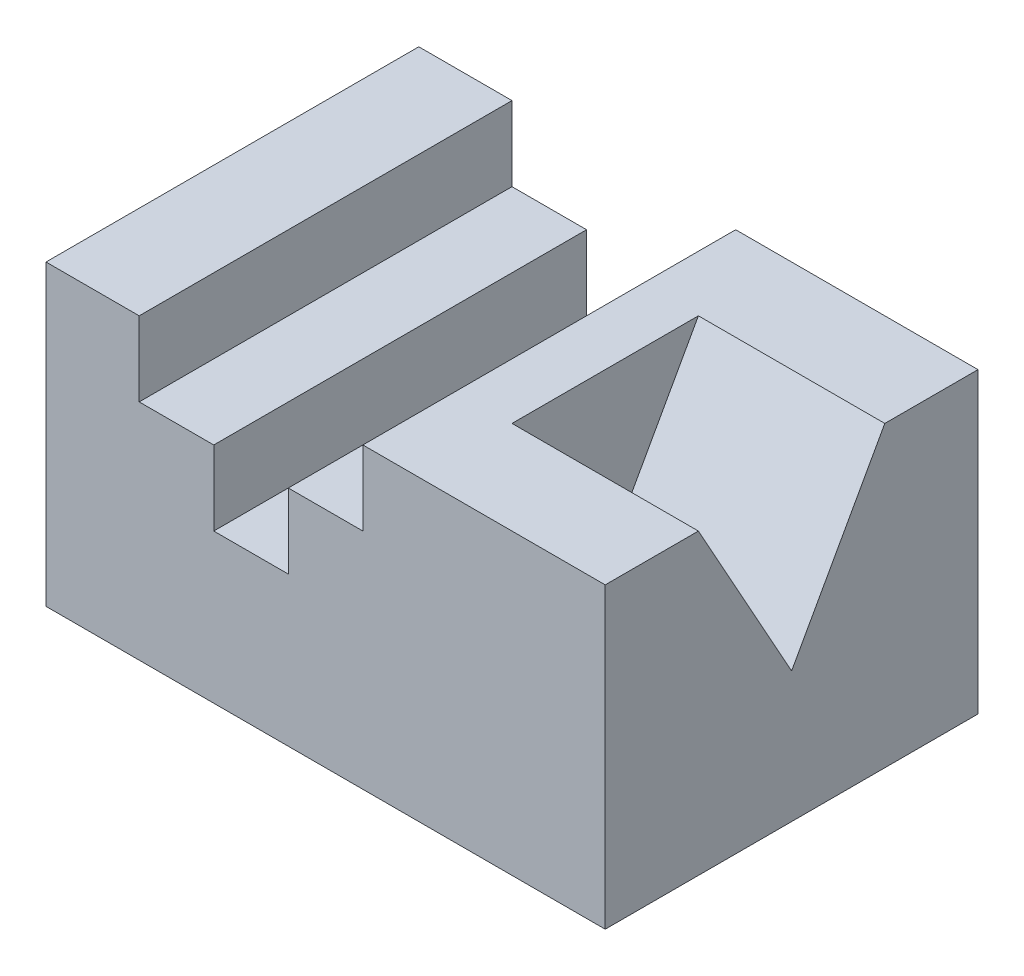
ISO-10303-21;
HEADER;
FILE_DESCRIPTION(('STEP AP214'),'2;1');
FILE_NAME('part.step','',(''),(''),'','','');
FILE_SCHEMA(('AUTOMOTIVE_DESIGN { 1 0 10303 214 1 1 1 1 }'));
ENDSEC;
DATA;
#1=APPLICATION_CONTEXT('core data for automotive mechanical design processes');
#2=APPLICATION_PROTOCOL_DEFINITION('international standard','automotive_design',2000,#1);
#3=PRODUCT_CONTEXT('',#1,'mechanical');
#4=PRODUCT('Part','Part','',(#3));
#5=PRODUCT_RELATED_PRODUCT_CATEGORY('part','',(#4));
#6=PRODUCT_DEFINITION_FORMATION('','',#4);
#7=PRODUCT_DEFINITION_CONTEXT('part definition',#1,'design');
#8=PRODUCT_DEFINITION('design','',#6,#7);
#9=PRODUCT_DEFINITION_SHAPE('','',#8);
#10=(LENGTH_UNIT() NAMED_UNIT(*) SI_UNIT(.MILLI.,.METRE.));
#11=(NAMED_UNIT(*) PLANE_ANGLE_UNIT() SI_UNIT($,.RADIAN.));
#12=(NAMED_UNIT(*) SI_UNIT($,.STERADIAN.) SOLID_ANGLE_UNIT());
#13=UNCERTAINTY_MEASURE_WITH_UNIT(LENGTH_MEASURE(1.E-05),#10,'distance_accuracy_value','');
#14=(GEOMETRIC_REPRESENTATION_CONTEXT(3) GLOBAL_UNCERTAINTY_ASSIGNED_CONTEXT((#13)) GLOBAL_UNIT_ASSIGNED_CONTEXT((#10,
#11,#12)) REPRESENTATION_CONTEXT('',''));
#15=CARTESIAN_POINT('',(0.,0.,0.));
#16=DIRECTION('',(0.,0.,1.));
#17=DIRECTION('',(1.,0.,0.));
#18=AXIS2_PLACEMENT_3D('',#15,#16,#17);
#19=CARTESIAN_POINT('',(150.,0.,-100.));
#20=DIRECTION('',(0.,-1.,0.));
#21=DIRECTION('',(1.,0.,0.));
#22=AXIS2_PLACEMENT_3D('',#19,#20,#21);
#23=PLANE('',#22);
#24=DIRECTION('',(1.,0.,0.));
#25=VECTOR('',#24,1.);
#26=CARTESIAN_POINT('',(150.,0.,0.));
#27=LINE('',#26,#25);
#28=CARTESIAN_POINT('',(0.,0.,0.));
#29=VERTEX_POINT('',#28);
#30=CARTESIAN_POINT('',(150.,0.,0.));
#31=VERTEX_POINT('',#30);
#32=EDGE_CURVE('E184',#29,#31,#27,.T.);
#33=ORIENTED_EDGE('',*,*,#32,.F.);
#34=DIRECTION('',(0.,0.,1.));
#35=VECTOR('',#34,1.);
#36=CARTESIAN_POINT('',(0.,0.,-100.));
#37=LINE('',#36,#35);
#38=CARTESIAN_POINT('',(0.,0.,-100.));
#39=VERTEX_POINT('',#38);
#40=EDGE_CURVE('E11',#39,#29,#37,.T.);
#41=ORIENTED_EDGE('',*,*,#40,.F.);
#42=DIRECTION('',(1.,0.,0.));
#43=VECTOR('',#42,1.);
#44=CARTESIAN_POINT('',(150.,0.,-100.));
#45=LINE('',#44,#43);
#46=CARTESIAN_POINT('',(150.,0.,-100.));
#47=VERTEX_POINT('',#46);
#48=EDGE_CURVE('E229',#39,#47,#45,.T.);
#49=ORIENTED_EDGE('',*,*,#48,.T.);
#50=DIRECTION('',(0.,0.,1.));
#51=VECTOR('',#50,1.);
#52=CARTESIAN_POINT('',(150.,0.,-100.));
#53=LINE('',#52,#51);
#54=EDGE_CURVE('E48',#47,#31,#53,.T.);
#55=ORIENTED_EDGE('',*,*,#54,.T.);
#56=EDGE_LOOP('',(#33,#41,#49,#55));
#57=FACE_BOUND('',#56,.T.);
#58=ADVANCED_FACE('F45',(#57),#23,.T.);
#59=CARTESIAN_POINT('',(0.,0.,-100.));
#60=DIRECTION('',(-1.,0.,0.));
#61=DIRECTION('',(0.,0.,1.));
#62=AXIS2_PLACEMENT_3D('',#59,#60,#61);
#63=PLANE('',#62);
#64=DIRECTION('',(0.,-1.,0.));
#65=VECTOR('',#64,1.);
#66=CARTESIAN_POINT('',(0.,0.,0.));
#67=LINE('',#66,#65);
#68=CARTESIAN_POINT('',(0.,80.,0.));
#69=VERTEX_POINT('',#68);
#70=EDGE_CURVE('E226',#69,#29,#67,.T.);
#71=ORIENTED_EDGE('',*,*,#70,.F.);
#72=DIRECTION('',(0.,0.,1.));
#73=VECTOR('',#72,1.);
#74=CARTESIAN_POINT('',(0.,80.,-100.));
#75=LINE('',#74,#73);
#76=CARTESIAN_POINT('',(0.,80.,-100.));
#77=VERTEX_POINT('',#76);
#78=EDGE_CURVE('E54',#77,#69,#75,.T.);
#79=ORIENTED_EDGE('',*,*,#78,.F.);
#80=DIRECTION('',(0.,-1.,0.));
#81=VECTOR('',#80,1.);
#82=CARTESIAN_POINT('',(0.,0.,-100.));
#83=LINE('',#82,#81);
#84=EDGE_CURVE('E170',#77,#39,#83,.T.);
#85=ORIENTED_EDGE('',*,*,#84,.T.);
#86=ORIENTED_EDGE('',*,*,#40,.T.);
#87=EDGE_LOOP('',(#71,#79,#85,#86));
#88=FACE_BOUND('',#87,.T.);
#89=ADVANCED_FACE('F267',(#88),#63,.T.);
#90=CARTESIAN_POINT('',(0.,80.,-100.));
#91=DIRECTION('',(0.,1.,0.));
#92=DIRECTION('',(0.,0.,1.));
#93=AXIS2_PLACEMENT_3D('',#90,#91,#92);
#94=PLANE('',#93);
#95=DIRECTION('',(-1.,0.,0.));
#96=VECTOR('',#95,1.);
#97=CARTESIAN_POINT('',(0.,80.,0.));
#98=LINE('',#97,#96);
#99=CARTESIAN_POINT('',(25.,80.,0.));
#100=VERTEX_POINT('',#99);
#101=EDGE_CURVE('E156',#100,#69,#98,.T.);
#102=ORIENTED_EDGE('',*,*,#101,.F.);
#103=DIRECTION('',(0.,0.,1.));
#104=VECTOR('',#103,1.);
#105=CARTESIAN_POINT('',(25.,80.,-100.));
#106=LINE('',#105,#104);
#107=CARTESIAN_POINT('',(25.,80.,-100.));
#108=VERTEX_POINT('',#107);
#109=EDGE_CURVE('E150',#108,#100,#106,.T.);
#110=ORIENTED_EDGE('',*,*,#109,.F.);
#111=DIRECTION('',(-1.,0.,0.));
#112=VECTOR('',#111,1.);
#113=CARTESIAN_POINT('',(0.,80.,-100.));
#114=LINE('',#113,#112);
#115=EDGE_CURVE('E153',#108,#77,#114,.T.);
#116=ORIENTED_EDGE('',*,*,#115,.T.);
#117=ORIENTED_EDGE('',*,*,#78,.T.);
#118=EDGE_LOOP('',(#102,#110,#116,#117));
#119=FACE_BOUND('',#118,.T.);
#120=ADVANCED_FACE('F152',(#119),#94,.T.);
#121=CARTESIAN_POINT('',(25.,80.,-100.));
#122=DIRECTION('',(1.,0.,0.));
#123=DIRECTION('',(0.,1.,0.));
#124=AXIS2_PLACEMENT_3D('',#121,#122,#123);
#125=PLANE('',#124);
#126=DIRECTION('',(0.,1.,0.));
#127=VECTOR('',#126,1.);
#128=CARTESIAN_POINT('',(25.,80.,0.));
#129=LINE('',#128,#127);
#130=CARTESIAN_POINT('',(25.,60.,0.));
#131=VERTEX_POINT('',#130);
#132=EDGE_CURVE('E221',#131,#100,#129,.T.);
#133=ORIENTED_EDGE('',*,*,#132,.F.);
#134=DIRECTION('',(0.,0.,1.));
#135=VECTOR('',#134,1.);
#136=CARTESIAN_POINT('',(25.,60.,-100.));
#137=LINE('',#136,#135);
#138=CARTESIAN_POINT('',(25.,60.,-100.));
#139=VERTEX_POINT('',#138);
#140=EDGE_CURVE('E162',#139,#131,#137,.T.);
#141=ORIENTED_EDGE('',*,*,#140,.F.);
#142=DIRECTION('',(0.,1.,0.));
#143=VECTOR('',#142,1.);
#144=CARTESIAN_POINT('',(25.,80.,-100.));
#145=LINE('',#144,#143);
#146=EDGE_CURVE('E168',#139,#108,#145,.T.);
#147=ORIENTED_EDGE('',*,*,#146,.T.);
#148=ORIENTED_EDGE('',*,*,#109,.T.);
#149=EDGE_LOOP('',(#133,#141,#147,#148));
#150=FACE_BOUND('',#149,.T.);
#151=ADVANCED_FACE('F173',(#150),#125,.T.);
#152=CARTESIAN_POINT('',(25.,60.,-100.));
#153=DIRECTION('',(0.,1.,0.));
#154=DIRECTION('',(0.,0.,1.));
#155=AXIS2_PLACEMENT_3D('',#152,#153,#154);
#156=PLANE('',#155);
#157=DIRECTION('',(-1.,0.,0.));
#158=VECTOR('',#157,1.);
#159=CARTESIAN_POINT('',(25.,60.,0.));
#160=LINE('',#159,#158);
#161=CARTESIAN_POINT('',(45.,60.,0.));
#162=VERTEX_POINT('',#161);
#163=EDGE_CURVE('E217',#162,#131,#160,.T.);
#164=ORIENTED_EDGE('',*,*,#163,.F.);
#165=DIRECTION('',(0.,0.,1.));
#166=VECTOR('',#165,1.);
#167=CARTESIAN_POINT('',(45.,60.,-100.));
#168=LINE('',#167,#166);
#169=CARTESIAN_POINT('',(45.,60.,-100.));
#170=VERTEX_POINT('',#169);
#171=EDGE_CURVE('E235',#170,#162,#168,.T.);
#172=ORIENTED_EDGE('',*,*,#171,.F.);
#173=DIRECTION('',(-1.,0.,0.));
#174=VECTOR('',#173,1.);
#175=CARTESIAN_POINT('',(25.,60.,-100.));
#176=LINE('',#175,#174);
#177=EDGE_CURVE('E175',#170,#139,#176,.T.);
#178=ORIENTED_EDGE('',*,*,#177,.T.);
#179=ORIENTED_EDGE('',*,*,#140,.T.);
#180=EDGE_LOOP('',(#164,#172,#178,#179));
#181=FACE_BOUND('',#180,.T.);
#182=ADVANCED_FACE('F280',(#181),#156,.T.);
#183=CARTESIAN_POINT('',(45.,60.,-100.));
#184=DIRECTION('',(1.,0.,0.));
#185=DIRECTION('',(0.,1.,0.));
#186=AXIS2_PLACEMENT_3D('',#183,#184,#185);
#187=PLANE('',#186);
#188=DIRECTION('',(0.,1.,0.));
#189=VECTOR('',#188,1.);
#190=CARTESIAN_POINT('',(45.,60.,0.));
#191=LINE('',#190,#189);
#192=CARTESIAN_POINT('',(45.,40.,0.));
#193=VERTEX_POINT('',#192);
#194=EDGE_CURVE('E213',#193,#162,#191,.T.);
#195=ORIENTED_EDGE('',*,*,#194,.F.);
#196=DIRECTION('',(0.,0.,1.));
#197=VECTOR('',#196,1.);
#198=CARTESIAN_POINT('',(45.,40.,-100.));
#199=LINE('',#198,#197);
#200=CARTESIAN_POINT('',(45.,40.,-100.));
#201=VERTEX_POINT('',#200);
#202=EDGE_CURVE('E238',#201,#193,#199,.T.);
#203=ORIENTED_EDGE('',*,*,#202,.F.);
#204=DIRECTION('',(0.,1.,0.));
#205=VECTOR('',#204,1.);
#206=CARTESIAN_POINT('',(45.,60.,-100.));
#207=LINE('',#206,#205);
#208=EDGE_CURVE('E178',#201,#170,#207,.T.);
#209=ORIENTED_EDGE('',*,*,#208,.T.);
#210=ORIENTED_EDGE('',*,*,#171,.T.);
#211=EDGE_LOOP('',(#195,#203,#209,#210));
#212=FACE_BOUND('',#211,.T.);
#213=ADVANCED_FACE('F283',(#212),#187,.T.);
#214=CARTESIAN_POINT('',(45.,40.,-100.));
#215=DIRECTION('',(0.,1.,0.));
#216=DIRECTION('',(-1.,0.,0.));
#217=AXIS2_PLACEMENT_3D('',#214,#215,#216);
#218=PLANE('',#217);
#219=DIRECTION('',(-1.,0.,0.));
#220=VECTOR('',#219,1.);
#221=CARTESIAN_POINT('',(45.,40.,0.));
#222=LINE('',#221,#220);
#223=CARTESIAN_POINT('',(65.,40.,0.));
#224=VERTEX_POINT('',#223);
#225=EDGE_CURVE('E209',#224,#193,#222,.T.);
#226=ORIENTED_EDGE('',*,*,#225,.F.);
#227=DIRECTION('',(0.,0.,1.));
#228=VECTOR('',#227,1.);
#229=CARTESIAN_POINT('',(65.,40.,-100.));
#230=LINE('',#229,#228);
#231=CARTESIAN_POINT('',(65.,40.,-100.));
#232=VERTEX_POINT('',#231);
#233=EDGE_CURVE('E241',#232,#224,#230,.T.);
#234=ORIENTED_EDGE('',*,*,#233,.F.);
#235=DIRECTION('',(-1.,0.,0.));
#236=VECTOR('',#235,1.);
#237=CARTESIAN_POINT('',(45.,40.,-100.));
#238=LINE('',#237,#236);
#239=EDGE_CURVE('E371',#232,#201,#238,.T.);
#240=ORIENTED_EDGE('',*,*,#239,.T.);
#241=ORIENTED_EDGE('',*,*,#202,.T.);
#242=EDGE_LOOP('',(#226,#234,#240,#241));
#243=FACE_BOUND('',#242,.T.);
#244=ADVANCED_FACE('F287',(#243),#218,.T.);
#245=CARTESIAN_POINT('',(65.,40.,-100.));
#246=DIRECTION('',(-1.,0.,0.));
#247=DIRECTION('',(0.,-1.,0.));
#248=AXIS2_PLACEMENT_3D('',#245,#246,#247);
#249=PLANE('',#248);
#250=DIRECTION('',(0.,-1.,0.));
#251=VECTOR('',#250,1.);
#252=CARTESIAN_POINT('',(65.,40.,0.));
#253=LINE('',#252,#251);
#254=CARTESIAN_POINT('',(65.,60.,0.));
#255=VERTEX_POINT('',#254);
#256=EDGE_CURVE('E205',#255,#224,#253,.T.);
#257=ORIENTED_EDGE('',*,*,#256,.F.);
#258=DIRECTION('',(0.,0.,1.));
#259=VECTOR('',#258,1.);
#260=CARTESIAN_POINT('',(65.,60.,-100.));
#261=LINE('',#260,#259);
#262=CARTESIAN_POINT('',(65.,60.,-100.));
#263=VERTEX_POINT('',#262);
#264=EDGE_CURVE('E244',#263,#255,#261,.T.);
#265=ORIENTED_EDGE('',*,*,#264,.F.);
#266=DIRECTION('',(0.,-1.,0.));
#267=VECTOR('',#266,1.);
#268=CARTESIAN_POINT('',(65.,40.,-100.));
#269=LINE('',#268,#267);
#270=EDGE_CURVE('E367',#263,#232,#269,.T.);
#271=ORIENTED_EDGE('',*,*,#270,.T.);
#272=ORIENTED_EDGE('',*,*,#233,.T.);
#273=EDGE_LOOP('',(#257,#265,#271,#272));
#274=FACE_BOUND('',#273,.T.);
#275=ADVANCED_FACE('F291',(#274),#249,.T.);
#276=CARTESIAN_POINT('',(65.,60.,-100.));
#277=DIRECTION('',(0.,1.,0.));
#278=DIRECTION('',(0.,0.,1.));
#279=AXIS2_PLACEMENT_3D('',#276,#277,#278);
#280=PLANE('',#279);
#281=DIRECTION('',(-1.,0.,0.));
#282=VECTOR('',#281,1.);
#283=CARTESIAN_POINT('',(65.,60.,0.));
#284=LINE('',#283,#282);
#285=CARTESIAN_POINT('',(85.,60.,0.));
#286=VERTEX_POINT('',#285);
#287=EDGE_CURVE('E201',#286,#255,#284,.T.);
#288=ORIENTED_EDGE('',*,*,#287,.F.);
#289=DIRECTION('',(0.,0.,1.));
#290=VECTOR('',#289,1.);
#291=CARTESIAN_POINT('',(85.,60.,-100.));
#292=LINE('',#291,#290);
#293=CARTESIAN_POINT('',(85.,60.,-100.));
#294=VERTEX_POINT('',#293);
#295=EDGE_CURVE('E247',#294,#286,#292,.T.);
#296=ORIENTED_EDGE('',*,*,#295,.F.);
#297=DIRECTION('',(-1.,0.,0.));
#298=VECTOR('',#297,1.);
#299=CARTESIAN_POINT('',(65.,60.,-100.));
#300=LINE('',#299,#298);
#301=EDGE_CURVE('E363',#294,#263,#300,.T.);
#302=ORIENTED_EDGE('',*,*,#301,.T.);
#303=ORIENTED_EDGE('',*,*,#264,.T.);
#304=EDGE_LOOP('',(#288,#296,#302,#303));
#305=FACE_BOUND('',#304,.T.);
#306=ADVANCED_FACE('F295',(#305),#280,.T.);
#307=CARTESIAN_POINT('',(85.,60.,-100.));
#308=DIRECTION('',(-1.,0.,0.));
#309=DIRECTION('',(0.,0.,1.));
#310=AXIS2_PLACEMENT_3D('',#307,#308,#309);
#311=PLANE('',#310);
#312=DIRECTION('',(0.,-1.,0.));
#313=VECTOR('',#312,1.);
#314=CARTESIAN_POINT('',(85.,60.,0.));
#315=LINE('',#314,#313);
#316=CARTESIAN_POINT('',(85.,80.,0.));
#317=VERTEX_POINT('',#316);
#318=EDGE_CURVE('E197',#317,#286,#315,.T.);
#319=ORIENTED_EDGE('',*,*,#318,.F.);
#320=DIRECTION('',(0.,0.,1.));
#321=VECTOR('',#320,1.);
#322=CARTESIAN_POINT('',(85.,80.,-100.));
#323=LINE('',#322,#321);
#324=CARTESIAN_POINT('',(85.,80.,-100.));
#325=VERTEX_POINT('',#324);
#326=EDGE_CURVE('E250',#325,#317,#323,.T.);
#327=ORIENTED_EDGE('',*,*,#326,.F.);
#328=DIRECTION('',(0.,-1.,0.));
#329=VECTOR('',#328,1.);
#330=CARTESIAN_POINT('',(85.,60.,-100.));
#331=LINE('',#330,#329);
#332=EDGE_CURVE('E359',#325,#294,#331,.T.);
#333=ORIENTED_EDGE('',*,*,#332,.T.);
#334=ORIENTED_EDGE('',*,*,#295,.T.);
#335=EDGE_LOOP('',(#319,#327,#333,#334));
#336=FACE_BOUND('',#335,.T.);
#337=ADVANCED_FACE('F299',(#336),#311,.T.);
#338=CARTESIAN_POINT('',(85.,80.,-100.));
#339=DIRECTION('',(0.,1.,0.));
#340=DIRECTION('',(0.,0.,1.));
#341=AXIS2_PLACEMENT_3D('',#338,#339,#340);
#342=PLANE('',#341);
#343=DIRECTION('',(-1.,0.,0.));
#344=VECTOR('',#343,1.);
#345=CARTESIAN_POINT('',(584.03853654145,80.,-75.));
#346=LINE('',#345,#344);
#347=CARTESIAN_POINT('',(150.,80.,-75.));
#348=VERTEX_POINT('',#347);
#349=CARTESIAN_POINT('',(100.,80.,-75.));
#350=VERTEX_POINT('',#349);
#351=EDGE_CURVE('E62',#348,#350,#346,.T.);
#352=ORIENTED_EDGE('',*,*,#351,.F.);
#353=DIRECTION('',(0.,0.,1.));
#354=VECTOR('',#353,1.);
#355=CARTESIAN_POINT('',(150.,80.,-100.));
#356=LINE('',#355,#354);
#357=CARTESIAN_POINT('',(150.,80.,-100.));
#358=VERTEX_POINT('',#357);
#359=EDGE_CURVE('E252',#358,#348,#356,.T.);
#360=ORIENTED_EDGE('',*,*,#359,.F.);
#361=DIRECTION('',(-1.,0.,0.));
#362=VECTOR('',#361,1.);
#363=CARTESIAN_POINT('',(85.,80.,-100.));
#364=LINE('',#363,#362);
#365=EDGE_CURVE('E355',#358,#325,#364,.T.);
#366=ORIENTED_EDGE('',*,*,#365,.T.);
#367=ORIENTED_EDGE('',*,*,#326,.T.);
#368=DIRECTION('',(-1.,0.,0.));
#369=VECTOR('',#368,1.);
#370=CARTESIAN_POINT('',(85.,80.,0.));
#371=LINE('',#370,#369);
#372=CARTESIAN_POINT('',(150.,80.,0.));
#373=VERTEX_POINT('',#372);
#374=EDGE_CURVE('E193',#373,#317,#371,.T.);
#375=ORIENTED_EDGE('',*,*,#374,.F.);
#376=CARTESIAN_POINT('',(150.,80.,-25.));
#377=VERTEX_POINT('',#376);
#378=EDGE_CURVE('E255',#377,#373,#356,.T.);
#379=ORIENTED_EDGE('',*,*,#378,.F.);
#380=DIRECTION('',(-1.,0.,0.));
#381=VECTOR('',#380,1.);
#382=CARTESIAN_POINT('',(584.03853654145,80.,-25.));
#383=LINE('',#382,#381);
#384=CARTESIAN_POINT('',(100.,80.,-25.));
#385=VERTEX_POINT('',#384);
#386=EDGE_CURVE('E391',#377,#385,#383,.T.);
#387=ORIENTED_EDGE('',*,*,#386,.T.);
#388=DIRECTION('',(0.,0.,1.));
#389=VECTOR('',#388,1.);
#390=CARTESIAN_POINT('',(100.,80.,-100.));
#391=LINE('',#390,#389);
#392=EDGE_CURVE('E345',#350,#385,#391,.T.);
#393=ORIENTED_EDGE('',*,*,#392,.F.);
#394=EDGE_LOOP('',(#352,#360,#366,#367,#375,#379,#387,#393));
#395=FACE_BOUND('',#394,.T.);
#396=ADVANCED_FACE('F303',(#395),#342,.T.);
#397=CARTESIAN_POINT('',(150.,80.,-100.));
#398=DIRECTION('',(1.,0.,0.));
#399=DIRECTION('',(0.,0.,-1.));
#400=AXIS2_PLACEMENT_3D('',#397,#398,#399);
#401=PLANE('',#400);
#402=DIRECTION('',(0.,0.874157276121538,-0.485642931178632));
#403=VECTOR('',#402,1.);
#404=CARTESIAN_POINT('',(150.,35.,-50.));
#405=LINE('',#404,#403);
#406=CARTESIAN_POINT('',(150.,35.,-50.));
#407=VERTEX_POINT('',#406);
#408=EDGE_CURVE('E331',#407,#348,#405,.T.);
#409=ORIENTED_EDGE('',*,*,#408,.F.);
#410=DIRECTION('',(0.,-0.874157276121538,-0.485642931178632));
#411=VECTOR('',#410,1.);
#412=CARTESIAN_POINT('',(150.,80.,-25.));
#413=LINE('',#412,#411);
#414=EDGE_CURVE('E189',#377,#407,#413,.T.);
#415=ORIENTED_EDGE('',*,*,#414,.F.);
#416=ORIENTED_EDGE('',*,*,#378,.T.);
#417=DIRECTION('',(0.,1.,0.));
#418=VECTOR('',#417,1.);
#419=CARTESIAN_POINT('',(150.,80.,0.));
#420=LINE('',#419,#418);
#421=EDGE_CURVE('E188',#31,#373,#420,.T.);
#422=ORIENTED_EDGE('',*,*,#421,.F.);
#423=ORIENTED_EDGE('',*,*,#54,.F.);
#424=DIRECTION('',(0.,1.,0.));
#425=VECTOR('',#424,1.);
#426=CARTESIAN_POINT('',(150.,80.,-100.));
#427=LINE('',#426,#425);
#428=EDGE_CURVE('E352',#47,#358,#427,.T.);
#429=ORIENTED_EDGE('',*,*,#428,.T.);
#430=ORIENTED_EDGE('',*,*,#359,.T.);
#431=EDGE_LOOP('',(#409,#415,#416,#422,#423,#429,#430));
#432=FACE_BOUND('',#431,.T.);
#433=ADVANCED_FACE('F264',(#432),#401,.T.);
#434=CARTESIAN_POINT('',(0.,0.,-100.));
#435=DIRECTION('',(0.,0.,-1.));
#436=DIRECTION('',(-1.,0.,0.));
#437=AXIS2_PLACEMENT_3D('',#434,#435,#436);
#438=PLANE('',#437);
#439=ORIENTED_EDGE('',*,*,#48,.F.);
#440=ORIENTED_EDGE('',*,*,#84,.F.);
#441=ORIENTED_EDGE('',*,*,#115,.F.);
#442=ORIENTED_EDGE('',*,*,#146,.F.);
#443=ORIENTED_EDGE('',*,*,#177,.F.);
#444=ORIENTED_EDGE('',*,*,#208,.F.);
#445=ORIENTED_EDGE('',*,*,#239,.F.);
#446=ORIENTED_EDGE('',*,*,#270,.F.);
#447=ORIENTED_EDGE('',*,*,#301,.F.);
#448=ORIENTED_EDGE('',*,*,#332,.F.);
#449=ORIENTED_EDGE('',*,*,#365,.F.);
#450=ORIENTED_EDGE('',*,*,#428,.F.);
#451=EDGE_LOOP('',(#439,#440,#441,#442,#443,#444,#445,#446,#447,#448,#449,#450));
#452=FACE_BOUND('',#451,.T.);
#453=ADVANCED_FACE('F166',(#452),#438,.T.);
#454=CARTESIAN_POINT('',(0.,0.,0.));
#455=DIRECTION('',(0.,0.,-1.));
#456=DIRECTION('',(-1.,0.,0.));
#457=AXIS2_PLACEMENT_3D('',#454,#455,#456);
#458=PLANE('',#457);
#459=ORIENTED_EDGE('',*,*,#32,.T.);
#460=ORIENTED_EDGE('',*,*,#421,.T.);
#461=ORIENTED_EDGE('',*,*,#374,.T.);
#462=ORIENTED_EDGE('',*,*,#318,.T.);
#463=ORIENTED_EDGE('',*,*,#287,.T.);
#464=ORIENTED_EDGE('',*,*,#256,.T.);
#465=ORIENTED_EDGE('',*,*,#225,.T.);
#466=ORIENTED_EDGE('',*,*,#194,.T.);
#467=ORIENTED_EDGE('',*,*,#163,.T.);
#468=ORIENTED_EDGE('',*,*,#132,.T.);
#469=ORIENTED_EDGE('',*,*,#101,.T.);
#470=ORIENTED_EDGE('',*,*,#70,.T.);
#471=EDGE_LOOP('',(#459,#460,#461,#462,#463,#464,#465,#466,#467,#468,#469,#470));
#472=FACE_BOUND('',#471,.T.);
#473=ADVANCED_FACE('F266',(#472),#458,.F.);
#474=CARTESIAN_POINT('',(584.03853654145,35.,-50.));
#475=DIRECTION('',(0.,0.485642931178632,0.874157276121538));
#476=DIRECTION('',(0.,-0.874157276121538,0.485642931178632));
#477=AXIS2_PLACEMENT_3D('',#474,#475,#476);
#478=PLANE('',#477);
#479=DIRECTION('',(-1.,0.,0.));
#480=VECTOR('',#479,1.);
#481=CARTESIAN_POINT('',(584.03853654145,35.,-50.));
#482=LINE('',#481,#480);
#483=CARTESIAN_POINT('',(100.,35.,-50.));
#484=VERTEX_POINT('',#483);
#485=EDGE_CURVE('E330',#407,#484,#482,.T.);
#486=ORIENTED_EDGE('',*,*,#485,.F.);
#487=ORIENTED_EDGE('',*,*,#408,.T.);
#488=ORIENTED_EDGE('',*,*,#351,.T.);
#489=DIRECTION('',(0.,0.874157276121538,-0.485642931178632));
#490=VECTOR('',#489,1.);
#491=CARTESIAN_POINT('',(100.,35.,-50.));
#492=LINE('',#491,#490);
#493=EDGE_CURVE('E333',#484,#350,#492,.T.);
#494=ORIENTED_EDGE('',*,*,#493,.F.);
#495=EDGE_LOOP('',(#486,#487,#488,#494));
#496=FACE_BOUND('',#495,.T.);
#497=ADVANCED_FACE('F315',(#496),#478,.T.);
#498=CARTESIAN_POINT('',(584.03853654145,80.,-25.));
#499=DIRECTION('',(0.,0.485642931178632,-0.874157276121538));
#500=DIRECTION('',(0.,0.874157276121538,0.485642931178632));
#501=AXIS2_PLACEMENT_3D('',#498,#499,#500);
#502=PLANE('',#501);
#503=ORIENTED_EDGE('',*,*,#386,.F.);
#504=ORIENTED_EDGE('',*,*,#414,.T.);
#505=ORIENTED_EDGE('',*,*,#485,.T.);
#506=DIRECTION('',(0.,-0.874157276121538,-0.485642931178632));
#507=VECTOR('',#506,1.);
#508=CARTESIAN_POINT('',(100.,80.,-25.));
#509=LINE('',#508,#507);
#510=EDGE_CURVE('E349',#385,#484,#509,.T.);
#511=ORIENTED_EDGE('',*,*,#510,.F.);
#512=EDGE_LOOP('',(#503,#504,#505,#511));
#513=FACE_BOUND('',#512,.T.);
#514=ADVANCED_FACE('F320',(#513),#502,.T.);
#515=CARTESIAN_POINT('',(100.,80.,-100.));
#516=DIRECTION('',(1.,0.,0.));
#517=DIRECTION('',(0.,0.,-1.));
#518=AXIS2_PLACEMENT_3D('',#515,#516,#517);
#519=PLANE('',#518);
#520=ORIENTED_EDGE('',*,*,#510,.T.);
#521=ORIENTED_EDGE('',*,*,#493,.T.);
#522=ORIENTED_EDGE('',*,*,#392,.T.);
#523=EDGE_LOOP('',(#520,#521,#522));
#524=FACE_BOUND('',#523,.T.);
#525=ADVANCED_FACE('F317',(#524),#519,.T.);
#526=CLOSED_SHELL('',(#58,#89,#120,#151,#182,#213,#244,#275,#306,#337,#396,#433,#453,#473,#497,
#514,#525));
#527=MANIFOLD_SOLID_BREP('B2',#526);
#528=ADVANCED_BREP_SHAPE_REPRESENTATION('',(#18,#527),#14);
#529=SHAPE_DEFINITION_REPRESENTATION(#9,#528);
ENDSEC;
END-ISO-10303-21;
